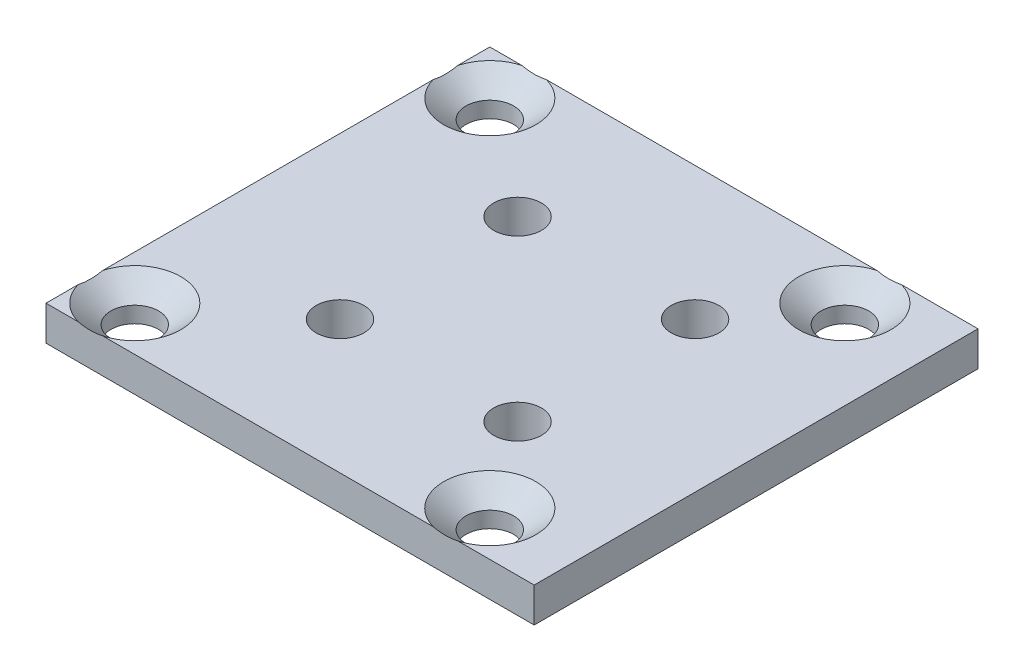
ISO-10303-21;
HEADER;
FILE_DESCRIPTION(('STEP AP214'),'2;1');
FILE_NAME('part.step','',(''),(''),'','','');
FILE_SCHEMA(('AUTOMOTIVE_DESIGN { 1 0 10303 214 1 1 1 1 }'));
ENDSEC;
DATA;
#1=APPLICATION_CONTEXT('core data for automotive mechanical design processes');
#2=APPLICATION_PROTOCOL_DEFINITION('international standard','automotive_design',2000,#1);
#3=PRODUCT_CONTEXT('',#1,'mechanical');
#4=PRODUCT('Part','Part','',(#3));
#5=PRODUCT_RELATED_PRODUCT_CATEGORY('part','',(#4));
#6=PRODUCT_DEFINITION_FORMATION('','',#4);
#7=PRODUCT_DEFINITION_CONTEXT('part definition',#1,'design');
#8=PRODUCT_DEFINITION('design','',#6,#7);
#9=PRODUCT_DEFINITION_SHAPE('','',#8);
#10=(LENGTH_UNIT() NAMED_UNIT(*) SI_UNIT(.MILLI.,.METRE.));
#11=(NAMED_UNIT(*) PLANE_ANGLE_UNIT() SI_UNIT($,.RADIAN.));
#12=(NAMED_UNIT(*) SI_UNIT($,.STERADIAN.) SOLID_ANGLE_UNIT());
#13=UNCERTAINTY_MEASURE_WITH_UNIT(LENGTH_MEASURE(1.E-05),#10,'distance_accuracy_value','');
#14=(GEOMETRIC_REPRESENTATION_CONTEXT(3) GLOBAL_UNCERTAINTY_ASSIGNED_CONTEXT((#13)) GLOBAL_UNIT_ASSIGNED_CONTEXT((#10,
#11,#12)) REPRESENTATION_CONTEXT('',''));
#15=CARTESIAN_POINT('',(0.,0.,0.));
#16=DIRECTION('',(0.,0.,1.));
#17=DIRECTION('',(1.,0.,0.));
#18=AXIS2_PLACEMENT_3D('',#15,#16,#17);
#19=CARTESIAN_POINT('',(0.,3.125,0.));
#20=DIRECTION('',(0.,-1.,0.));
#21=DIRECTION('',(0.,0.,-1.));
#22=AXIS2_PLACEMENT_3D('',#19,#20,#21);
#23=PLANE('',#22);
#24=CARTESIAN_POINT('',(-8.,3.125,-8.));
#25=DIRECTION('',(0.,1.,0.));
#26=DIRECTION('',(0.,0.,1.));
#27=AXIS2_PLACEMENT_3D('',#24,#25,#26);
#28=CIRCLE('',#27,2.14999999999999);
#29=CARTESIAN_POINT('',(-8.,3.125,-5.85000000000001));
#30=VERTEX_POINT('',#29);
#31=EDGE_CURVE('E152',#30,#30,#28,.T.);
#32=ORIENTED_EDGE('',*,*,#31,.F.);
#33=EDGE_LOOP('',(#32));
#34=FACE_BOUND('',#33,.T.);
#35=CARTESIAN_POINT('',(8.00000000000003,3.125,-7.99999999999997));
#36=DIRECTION('',(0.,1.,0.));
#37=DIRECTION('',(0.,0.,1.));
#38=AXIS2_PLACEMENT_3D('',#35,#36,#37);
#39=CIRCLE('',#38,2.14999999999999);
#40=CARTESIAN_POINT('',(8.00000000000003,3.125,-5.84999999999998));
#41=VERTEX_POINT('',#40);
#42=EDGE_CURVE('E159',#41,#41,#39,.T.);
#43=ORIENTED_EDGE('',*,*,#42,.F.);
#44=EDGE_LOOP('',(#43));
#45=FACE_BOUND('',#44,.T.);
#46=CARTESIAN_POINT('',(7.99999999999994,3.125,8.00000000000006));
#47=DIRECTION('',(0.,1.,0.));
#48=DIRECTION('',(0.,0.,1.));
#49=AXIS2_PLACEMENT_3D('',#46,#47,#48);
#50=CIRCLE('',#49,2.14999999999999);
#51=CARTESIAN_POINT('',(7.99999999999994,3.125,10.15));
#52=VERTEX_POINT('',#51);
#53=EDGE_CURVE('E165',#52,#52,#50,.T.);
#54=ORIENTED_EDGE('',*,*,#53,.F.);
#55=EDGE_LOOP('',(#54));
#56=FACE_BOUND('',#55,.T.);
#57=CARTESIAN_POINT('',(-8.00000000000008,3.125,7.99999999999992));
#58=DIRECTION('',(0.,1.,0.));
#59=DIRECTION('',(0.,0.,1.));
#60=AXIS2_PLACEMENT_3D('',#57,#58,#59);
#61=CIRCLE('',#60,2.14999999999999);
#62=CARTESIAN_POINT('',(-8.00000000000008,3.125,10.1499999999999));
#63=VERTEX_POINT('',#62);
#64=EDGE_CURVE('E171',#63,#63,#61,.T.);
#65=ORIENTED_EDGE('',*,*,#64,.F.);
#66=EDGE_LOOP('',(#65));
#67=FACE_BOUND('',#66,.T.);
#68=DIRECTION('',(0.,0.,-1.));
#69=VECTOR('',#68,1.);
#70=CARTESIAN_POINT('',(-22.5,3.125,-20.));
#71=LINE('',#70,#69);
#72=CARTESIAN_POINT('',(-22.5,3.125,14.8943327806252));
#73=VERTEX_POINT('',#72);
#74=CARTESIAN_POINT('',(-22.5,3.125,-14.8943327806252));
#75=VERTEX_POINT('',#74);
#76=EDGE_CURVE('E153',#73,#75,#71,.T.);
#77=ORIENTED_EDGE('',*,*,#76,.F.);
#78=CARTESIAN_POINT('',(-18.5,3.125,16.));
#79=DIRECTION('',(0.,-1.,0.));
#80=DIRECTION('',(0.,0.,-1.));
#81=AXIS2_PLACEMENT_3D('',#78,#79,#80);
#82=CIRCLE('',#81,4.15);
#83=CARTESIAN_POINT('',(-17.3943327806252,3.125,20.));
#84=VERTEX_POINT('',#83);
#85=EDGE_CURVE('E223',#73,#84,#82,.T.);
#86=ORIENTED_EDGE('',*,*,#85,.T.);
#87=DIRECTION('',(1.,0.,0.));
#88=VECTOR('',#87,1.);
#89=CARTESIAN_POINT('',(-21.5,3.125,20.));
#90=LINE('',#89,#88);
#91=CARTESIAN_POINT('',(12.3943327806252,3.125,20.));
#92=VERTEX_POINT('',#91);
#93=EDGE_CURVE('E202',#84,#92,#90,.T.);
#94=ORIENTED_EDGE('',*,*,#93,.T.);
#95=CARTESIAN_POINT('',(13.5,3.125,16.));
#96=DIRECTION('',(0.,-1.,0.));
#97=DIRECTION('',(0.,0.,-1.));
#98=AXIS2_PLACEMENT_3D('',#95,#96,#97);
#99=CIRCLE('',#98,4.15);
#100=CARTESIAN_POINT('',(14.6056672193748,3.125,20.));
#101=VERTEX_POINT('',#100);
#102=EDGE_CURVE('E214',#92,#101,#99,.T.);
#103=ORIENTED_EDGE('',*,*,#102,.T.);
#104=CARTESIAN_POINT('',(21.5,3.125,20.));
#105=VERTEX_POINT('',#104);
#106=EDGE_CURVE('E196',#101,#105,#90,.T.);
#107=ORIENTED_EDGE('',*,*,#106,.T.);
#108=DIRECTION('',(0.,0.,-1.));
#109=VECTOR('',#108,1.);
#110=CARTESIAN_POINT('',(21.5,3.125,20.));
#111=LINE('',#110,#109);
#112=CARTESIAN_POINT('',(21.5,3.125,-20.));
#113=VERTEX_POINT('',#112);
#114=EDGE_CURVE('E189',#105,#113,#111,.T.);
#115=ORIENTED_EDGE('',*,*,#114,.T.);
#116=DIRECTION('',(-1.,0.,0.));
#117=VECTOR('',#116,1.);
#118=CARTESIAN_POINT('',(-21.5,3.125,-20.));
#119=LINE('',#118,#117);
#120=CARTESIAN_POINT('',(14.6056672193749,3.125,-20.));
#121=VERTEX_POINT('',#120);
#122=EDGE_CURVE('E193',#113,#121,#119,.T.);
#123=ORIENTED_EDGE('',*,*,#122,.T.);
#124=CARTESIAN_POINT('',(13.5,3.125,-16.));
#125=DIRECTION('',(0.,-1.,0.));
#126=DIRECTION('',(0.,0.,-1.));
#127=AXIS2_PLACEMENT_3D('',#124,#125,#126);
#128=CIRCLE('',#127,4.15000000000001);
#129=CARTESIAN_POINT('',(12.3943327806252,3.125,-20.));
#130=VERTEX_POINT('',#129);
#131=EDGE_CURVE('E211',#121,#130,#128,.T.);
#132=ORIENTED_EDGE('',*,*,#131,.T.);
#133=CARTESIAN_POINT('',(-17.3943327806251,3.125,-20.));
#134=VERTEX_POINT('',#133);
#135=EDGE_CURVE('E197',#130,#134,#119,.T.);
#136=ORIENTED_EDGE('',*,*,#135,.T.);
#137=CARTESIAN_POINT('',(-18.5,3.125,-16.));
#138=DIRECTION('',(0.,-1.,0.));
#139=DIRECTION('',(0.,0.,-1.));
#140=AXIS2_PLACEMENT_3D('',#137,#138,#139);
#141=CIRCLE('',#140,4.15000000000001);
#142=EDGE_CURVE('E218',#134,#75,#141,.T.);
#143=ORIENTED_EDGE('',*,*,#142,.T.);
#144=EDGE_LOOP('',(#77,#86,#94,#103,#107,#115,#123,#132,#136,#143));
#145=FACE_BOUND('',#144,.T.);
#146=ADVANCED_FACE('F41',(#34,#45,#56,#67,#145),#23,.F.);
#147=CARTESIAN_POINT('',(-22.5,3.125,20.));
#148=VERTEX_POINT('',#147);
#149=CARTESIAN_POINT('',(-19.6056672193748,3.125,20.));
#150=VERTEX_POINT('',#149);
#151=EDGE_CURVE('E198',#148,#150,#90,.T.);
#152=ORIENTED_EDGE('',*,*,#151,.T.);
#153=CARTESIAN_POINT('',(-18.5,3.125,16.));
#154=DIRECTION('',(0.,-1.,0.));
#155=DIRECTION('',(0.,0.,-1.));
#156=AXIS2_PLACEMENT_3D('',#153,#154,#155);
#157=CIRCLE('',#156,4.15);
#158=CARTESIAN_POINT('',(-22.5,3.125,17.1056672193748));
#159=VERTEX_POINT('',#158);
#160=EDGE_CURVE('E221',#150,#159,#157,.T.);
#161=ORIENTED_EDGE('',*,*,#160,.T.);
#162=EDGE_CURVE('E150',#148,#159,#71,.T.);
#163=ORIENTED_EDGE('',*,*,#162,.F.);
#164=EDGE_LOOP('',(#152,#161,#163));
#165=FACE_BOUND('',#164,.T.);
#166=ADVANCED_FACE('F329',(#165),#23,.F.);
#167=CARTESIAN_POINT('',(21.5,3.125,20.));
#168=DIRECTION('',(-1.,0.,0.));
#169=DIRECTION('',(0.,0.,1.));
#170=AXIS2_PLACEMENT_3D('',#167,#168,#169);
#171=PLANE('',#170);
#172=DIRECTION('',(0.,0.,-1.));
#173=VECTOR('',#172,1.);
#174=CARTESIAN_POINT('',(21.5,0.,20.));
#175=LINE('',#174,#173);
#176=CARTESIAN_POINT('',(21.5,0.,20.));
#177=VERTEX_POINT('',#176);
#178=CARTESIAN_POINT('',(21.5,0.,-20.));
#179=VERTEX_POINT('',#178);
#180=EDGE_CURVE('E132',#177,#179,#175,.T.);
#181=ORIENTED_EDGE('',*,*,#180,.T.);
#182=DIRECTION('',(0.,-1.,0.));
#183=VECTOR('',#182,1.);
#184=CARTESIAN_POINT('',(21.5,3.125,-20.));
#185=LINE('',#184,#183);
#186=EDGE_CURVE('E127',#113,#179,#185,.T.);
#187=ORIENTED_EDGE('',*,*,#186,.F.);
#188=ORIENTED_EDGE('',*,*,#114,.F.);
#189=DIRECTION('',(0.,-1.,0.));
#190=VECTOR('',#189,1.);
#191=CARTESIAN_POINT('',(21.5,3.125,20.));
#192=LINE('',#191,#190);
#193=EDGE_CURVE('E201',#105,#177,#192,.T.);
#194=ORIENTED_EDGE('',*,*,#193,.T.);
#195=EDGE_LOOP('',(#181,#187,#188,#194));
#196=FACE_BOUND('',#195,.T.);
#197=ADVANCED_FACE('F254',(#196),#171,.F.);
#198=CARTESIAN_POINT('',(-21.5,3.125,-20.));
#199=DIRECTION('',(0.,0.,1.));
#200=DIRECTION('',(1.,0.,0.));
#201=AXIS2_PLACEMENT_3D('',#198,#199,#200);
#202=PLANE('',#201);
#203=CARTESIAN_POINT('',(-19.6056672193748,3.125,-20.));
#204=VERTEX_POINT('',#203);
#205=CARTESIAN_POINT('',(-22.5,3.125,-20.));
#206=VERTEX_POINT('',#205);
#207=EDGE_CURVE('E192',#204,#206,#119,.T.);
#208=ORIENTED_EDGE('',*,*,#207,.F.);
#209=CARTESIAN_POINT('',(-19.6056672193748,3.125,-20.));
#210=CARTESIAN_POINT('',(-19.5357221427361,3.10936150913505,-20.));
#211=CARTESIAN_POINT('',(-19.465486015488,3.09504081489913,-20.));
#212=CARTESIAN_POINT('',(-19.3244853267123,3.06920691655071,-20.));
#213=CARTESIAN_POINT('',(-19.2537206584983,3.05769429594836,-20.));
#214=CARTESIAN_POINT('',(-19.0407188629885,3.02762992715909,-20.));
#215=CARTESIAN_POINT('',(-18.8978127424541,3.01356052370965,-20.));
#216=CARTESIAN_POINT('',(-18.6140103942661,2.99843351019635,-20.));
#217=CARTESIAN_POINT('',(-18.4731266595971,2.99713710642101,-20.));
#218=CARTESIAN_POINT('',(-18.1918741309777,3.00701589463506,-20.));
#219=CARTESIAN_POINT('',(-18.0515050490301,3.01818249106688,-20.));
#220=CARTESIAN_POINT('',(-17.8685622718198,3.04050588756117,-20.));
#221=CARTESIAN_POINT('',(-17.8252884022186,3.04636123486814,-20.));
#222=CARTESIAN_POINT('',(-17.7389077202227,3.05916645281211,-20.));
#223=CARTESIAN_POINT('',(-17.6958008840591,3.06611616138666,-20.));
#224=CARTESIAN_POINT('',(-17.5662397079567,3.08864059426218,-20.));
#225=CARTESIAN_POINT('',(-17.4800613240869,3.10582682513863,-20.));
#226=CARTESIAN_POINT('',(-17.3943327806251,3.125,-20.));
#227=B_SPLINE_CURVE_WITH_KNOTS('',3,(#209,#210,#211,#212,#213,#214,#215,#216,#217,#218,#219,
#220,#221,#222,#223,#224,#225,#226),.UNSPECIFIED.,.F.,.F.,(4,2,2,2,2,2,2,2,4),(0.,
0.214992742343919,0.430030121614323,0.860223901715208,1.28235951314072,1.70420416332892,
1.83520082687546,1.96617810952037,2.22969253364859),.UNSPECIFIED.);
#228=EDGE_CURVE('E264',#204,#134,#227,.T.);
#229=ORIENTED_EDGE('',*,*,#228,.T.);
#230=ORIENTED_EDGE('',*,*,#135,.F.);
#231=CARTESIAN_POINT('',(12.3943327806252,3.125,-20.));
#232=CARTESIAN_POINT('',(12.4642778572639,3.10936150913505,-20.));
#233=CARTESIAN_POINT('',(12.534513984512,3.09504081489913,-20.));
#234=CARTESIAN_POINT('',(12.6755146732877,3.06920691655071,-20.));
#235=CARTESIAN_POINT('',(12.7462793415017,3.05769429594836,-20.));
#236=CARTESIAN_POINT('',(12.9592811370115,3.02762992715909,-20.));
#237=CARTESIAN_POINT('',(13.1021872575459,3.01356052370965,-20.));
#238=CARTESIAN_POINT('',(13.3859896057339,2.99843351019635,-20.));
#239=CARTESIAN_POINT('',(13.5268733404029,2.99713710642101,-20.));
#240=CARTESIAN_POINT('',(13.8081258690223,3.00701589463506,-20.));
#241=CARTESIAN_POINT('',(13.9484949509699,3.01818249106688,-20.));
#242=CARTESIAN_POINT('',(14.1314377281802,3.04050588756117,-20.));
#243=CARTESIAN_POINT('',(14.1747115977814,3.04636123486814,-20.));
#244=CARTESIAN_POINT('',(14.2610922797773,3.05916645281211,-20.));
#245=CARTESIAN_POINT('',(14.3041991159409,3.06611616138666,-20.));
#246=CARTESIAN_POINT('',(14.4337602920433,3.08864059426218,-20.));
#247=CARTESIAN_POINT('',(14.5199386759131,3.10582682513863,-20.));
#248=CARTESIAN_POINT('',(14.6056672193749,3.125,-20.));
#249=B_SPLINE_CURVE_WITH_KNOTS('',3,(#231,#232,#233,#234,#235,#236,#237,#238,#239,#240,#241,
#242,#243,#244,#245,#246,#247,#248),.UNSPECIFIED.,.F.,.F.,(4,2,2,2,2,2,2,2,4),(0.,
0.214992742343919,0.430030121614327,0.86022390171521,1.28235951314072,1.70420416332892,
1.83520082687547,1.96617810952037,2.22969253364859),.UNSPECIFIED.);
#250=EDGE_CURVE('E257',#130,#121,#249,.T.);
#251=ORIENTED_EDGE('',*,*,#250,.T.);
#252=ORIENTED_EDGE('',*,*,#122,.F.);
#253=ORIENTED_EDGE('',*,*,#186,.T.);
#254=DIRECTION('',(-1.,0.,0.));
#255=VECTOR('',#254,1.);
#256=CARTESIAN_POINT('',(-21.5,0.,-20.));
#257=LINE('',#256,#255);
#258=CARTESIAN_POINT('',(-22.5,0.,-20.));
#259=VERTEX_POINT('',#258);
#260=EDGE_CURVE('E120',#179,#259,#257,.T.);
#261=ORIENTED_EDGE('',*,*,#260,.T.);
#262=DIRECTION('',(0.,-1.,0.));
#263=VECTOR('',#262,1.);
#264=CARTESIAN_POINT('',(-22.5,0.,-20.));
#265=LINE('',#264,#263);
#266=EDGE_CURVE('E125',#206,#259,#265,.T.);
#267=ORIENTED_EDGE('',*,*,#266,.F.);
#268=EDGE_LOOP('',(#208,#229,#230,#251,#252,#253,#261,#267));
#269=FACE_BOUND('',#268,.T.);
#270=ADVANCED_FACE('F123',(#269),#202,.F.);
#271=CARTESIAN_POINT('',(-21.5,3.125,20.));
#272=DIRECTION('',(0.,0.,-1.));
#273=DIRECTION('',(-1.,0.,0.));
#274=AXIS2_PLACEMENT_3D('',#271,#272,#273);
#275=PLANE('',#274);
#276=ORIENTED_EDGE('',*,*,#93,.F.);
#277=CARTESIAN_POINT('',(-17.3943327806252,3.125,20.));
#278=CARTESIAN_POINT('',(-17.464277857264,3.10936150913505,20.));
#279=CARTESIAN_POINT('',(-17.534513984512,3.09504081489913,20.));
#280=CARTESIAN_POINT('',(-17.6755146732878,3.06920691655071,20.));
#281=CARTESIAN_POINT('',(-17.7462793415017,3.05769429594836,20.));
#282=CARTESIAN_POINT('',(-17.9592811370116,3.0276299271591,20.));
#283=CARTESIAN_POINT('',(-18.1021872575459,3.01356052370966,20.));
#284=CARTESIAN_POINT('',(-18.385989605734,2.99843351019636,20.));
#285=CARTESIAN_POINT('',(-18.526873340403,2.99713710642103,20.));
#286=CARTESIAN_POINT('',(-18.8081258690224,3.00701589463507,20.));
#287=CARTESIAN_POINT('',(-18.9484949509699,3.0181824910669,20.));
#288=CARTESIAN_POINT('',(-19.1314377281803,3.04050588756118,20.));
#289=CARTESIAN_POINT('',(-19.1747115977814,3.04636123486816,20.));
#290=CARTESIAN_POINT('',(-19.2610922797773,3.05916645281212,20.));
#291=CARTESIAN_POINT('',(-19.3041991159409,3.06611616138667,20.));
#292=CARTESIAN_POINT('',(-19.4337602920433,3.08864059426219,20.));
#293=CARTESIAN_POINT('',(-19.5199386759131,3.10582682513863,20.));
#294=CARTESIAN_POINT('',(-19.6056672193748,3.125,20.));
#295=B_SPLINE_CURVE_WITH_KNOTS('',3,(#277,#278,#279,#280,#281,#282,#283,#284,#285,#286,#287,
#288,#289,#290,#291,#292,#293,#294),.UNSPECIFIED.,.F.,.F.,(4,2,2,2,2,2,2,2,4),(0.,
0.214992742343922,0.430030121614333,0.860223901715214,1.28235951314073,1.70420416332894,
1.83520082687546,1.96617810952034,2.22969253364851),.UNSPECIFIED.);
#296=EDGE_CURVE('E232',#84,#150,#295,.T.);
#297=ORIENTED_EDGE('',*,*,#296,.T.);
#298=ORIENTED_EDGE('',*,*,#151,.F.);
#299=DIRECTION('',(0.,1.,0.));
#300=VECTOR('',#299,1.);
#301=CARTESIAN_POINT('',(-22.5,0.,20.));
#302=LINE('',#301,#300);
#303=CARTESIAN_POINT('',(-22.5,0.,20.));
#304=VERTEX_POINT('',#303);
#305=EDGE_CURVE('E140',#304,#148,#302,.T.);
#306=ORIENTED_EDGE('',*,*,#305,.F.);
#307=DIRECTION('',(1.,0.,0.));
#308=VECTOR('',#307,1.);
#309=CARTESIAN_POINT('',(-21.5,0.,20.));
#310=LINE('',#309,#308);
#311=EDGE_CURVE('E131',#304,#177,#310,.T.);
#312=ORIENTED_EDGE('',*,*,#311,.T.);
#313=ORIENTED_EDGE('',*,*,#193,.F.);
#314=ORIENTED_EDGE('',*,*,#106,.F.);
#315=CARTESIAN_POINT('',(14.6056672193748,3.125,20.));
#316=CARTESIAN_POINT('',(14.535722142736,3.10936150913505,20.));
#317=CARTESIAN_POINT('',(14.465486015488,3.09504081489913,20.));
#318=CARTESIAN_POINT('',(14.3244853267122,3.06920691655071,20.));
#319=CARTESIAN_POINT('',(14.2537206584983,3.05769429594836,20.));
#320=CARTESIAN_POINT('',(14.0407188629884,3.0276299271591,20.));
#321=CARTESIAN_POINT('',(13.8978127424541,3.01356052370966,20.));
#322=CARTESIAN_POINT('',(13.614010394266,2.99843351019636,20.));
#323=CARTESIAN_POINT('',(13.473126659597,2.99713710642103,20.));
#324=CARTESIAN_POINT('',(13.1918741309776,3.00701589463507,20.));
#325=CARTESIAN_POINT('',(13.0515050490301,3.0181824910669,20.));
#326=CARTESIAN_POINT('',(12.8685622718197,3.04050588756118,20.));
#327=CARTESIAN_POINT('',(12.8252884022186,3.04636123486816,20.));
#328=CARTESIAN_POINT('',(12.7389077202227,3.05916645281212,20.));
#329=CARTESIAN_POINT('',(12.6958008840591,3.06611616138667,20.));
#330=CARTESIAN_POINT('',(12.5662397079567,3.08864059426219,20.));
#331=CARTESIAN_POINT('',(12.4800613240869,3.10582682513863,20.));
#332=CARTESIAN_POINT('',(12.3943327806252,3.125,20.));
#333=B_SPLINE_CURVE_WITH_KNOTS('',3,(#315,#316,#317,#318,#319,#320,#321,#322,#323,#324,#325,
#326,#327,#328,#329,#330,#331,#332),.UNSPECIFIED.,.F.,.F.,(4,2,2,2,2,2,2,2,4),(0.,
0.214992742343921,0.430030121614333,0.860223901715221,1.28235951314073,1.70420416332894,
1.83520082687547,1.96617810952034,2.22969253364851),.UNSPECIFIED.);
#334=EDGE_CURVE('E57',#101,#92,#333,.T.);
#335=ORIENTED_EDGE('',*,*,#334,.T.);
#336=EDGE_LOOP('',(#276,#297,#298,#306,#312,#313,#314,#335));
#337=FACE_BOUND('',#336,.T.);
#338=ADVANCED_FACE('F243',(#337),#275,.F.);
#339=CARTESIAN_POINT('',(-22.5,3.125,-17.1056672193748));
#340=VERTEX_POINT('',#339);
#341=EDGE_CURVE('E145',#340,#206,#71,.T.);
#342=ORIENTED_EDGE('',*,*,#341,.F.);
#343=CARTESIAN_POINT('',(-18.5,3.125,-16.));
#344=DIRECTION('',(0.,-1.,0.));
#345=DIRECTION('',(0.,0.,-1.));
#346=AXIS2_PLACEMENT_3D('',#343,#344,#345);
#347=CIRCLE('',#346,4.15000000000001);
#348=EDGE_CURVE('E216',#340,#204,#347,.T.);
#349=ORIENTED_EDGE('',*,*,#348,.T.);
#350=ORIENTED_EDGE('',*,*,#207,.T.);
#351=EDGE_LOOP('',(#342,#349,#350));
#352=FACE_BOUND('',#351,.T.);
#353=ADVANCED_FACE('F248',(#352),#23,.F.);
#354=CARTESIAN_POINT('',(0.,0.,0.));
#355=DIRECTION('',(0.,-1.,0.));
#356=DIRECTION('',(0.,0.,-1.));
#357=AXIS2_PLACEMENT_3D('',#354,#355,#356);
#358=PLANE('',#357);
#359=CARTESIAN_POINT('',(-8.,0.,-8.));
#360=DIRECTION('',(0.,1.,0.));
#361=DIRECTION('',(0.,0.,1.));
#362=AXIS2_PLACEMENT_3D('',#359,#360,#361);
#363=CIRCLE('',#362,2.15);
#364=CARTESIAN_POINT('',(-8.,0.,-5.85));
#365=VERTEX_POINT('',#364);
#366=EDGE_CURVE('E156',#365,#365,#363,.T.);
#367=ORIENTED_EDGE('',*,*,#366,.T.);
#368=EDGE_LOOP('',(#367));
#369=FACE_BOUND('',#368,.T.);
#370=CARTESIAN_POINT('',(8.00000000000003,0.,-7.99999999999997));
#371=DIRECTION('',(0.,1.,0.));
#372=DIRECTION('',(0.,0.,1.));
#373=AXIS2_PLACEMENT_3D('',#370,#371,#372);
#374=CIRCLE('',#373,2.15);
#375=CARTESIAN_POINT('',(8.00000000000003,0.,-5.84999999999997));
#376=VERTEX_POINT('',#375);
#377=EDGE_CURVE('E162',#376,#376,#374,.T.);
#378=ORIENTED_EDGE('',*,*,#377,.T.);
#379=EDGE_LOOP('',(#378));
#380=FACE_BOUND('',#379,.T.);
#381=CARTESIAN_POINT('',(7.99999999999994,0.,8.00000000000006));
#382=DIRECTION('',(0.,1.,0.));
#383=DIRECTION('',(0.,0.,1.));
#384=AXIS2_PLACEMENT_3D('',#381,#382,#383);
#385=CIRCLE('',#384,2.15);
#386=CARTESIAN_POINT('',(7.99999999999994,0.,10.1500000000001));
#387=VERTEX_POINT('',#386);
#388=EDGE_CURVE('E168',#387,#387,#385,.T.);
#389=ORIENTED_EDGE('',*,*,#388,.T.);
#390=EDGE_LOOP('',(#389));
#391=FACE_BOUND('',#390,.T.);
#392=CARTESIAN_POINT('',(-8.00000000000008,0.,7.99999999999992));
#393=DIRECTION('',(0.,1.,0.));
#394=DIRECTION('',(0.,0.,1.));
#395=AXIS2_PLACEMENT_3D('',#392,#393,#394);
#396=CIRCLE('',#395,2.15);
#397=CARTESIAN_POINT('',(-8.00000000000008,0.,10.1499999999999));
#398=VERTEX_POINT('',#397);
#399=EDGE_CURVE('E174',#398,#398,#396,.T.);
#400=ORIENTED_EDGE('',*,*,#399,.T.);
#401=EDGE_LOOP('',(#400));
#402=FACE_BOUND('',#401,.T.);
#403=CARTESIAN_POINT('',(-18.5,0.,-16.));
#404=DIRECTION('',(0.,1.,0.));
#405=DIRECTION('',(0.,0.,1.));
#406=AXIS2_PLACEMENT_3D('',#403,#404,#405);
#407=CIRCLE('',#406,2.15);
#408=CARTESIAN_POINT('',(-18.5,0.,-13.85));
#409=VERTEX_POINT('',#408);
#410=EDGE_CURVE('E177',#409,#409,#407,.T.);
#411=ORIENTED_EDGE('',*,*,#410,.T.);
#412=EDGE_LOOP('',(#411));
#413=FACE_BOUND('',#412,.T.);
#414=CARTESIAN_POINT('',(13.5,0.,-16.));
#415=DIRECTION('',(0.,1.,0.));
#416=DIRECTION('',(0.,0.,1.));
#417=AXIS2_PLACEMENT_3D('',#414,#415,#416);
#418=CIRCLE('',#417,2.15);
#419=CARTESIAN_POINT('',(13.5,0.,-13.85));
#420=VERTEX_POINT('',#419);
#421=EDGE_CURVE('E180',#420,#420,#418,.T.);
#422=ORIENTED_EDGE('',*,*,#421,.T.);
#423=EDGE_LOOP('',(#422));
#424=FACE_BOUND('',#423,.T.);
#425=CARTESIAN_POINT('',(13.5,0.,16.));
#426=DIRECTION('',(0.,1.,0.));
#427=DIRECTION('',(0.,0.,1.));
#428=AXIS2_PLACEMENT_3D('',#425,#426,#427);
#429=CIRCLE('',#428,2.15);
#430=CARTESIAN_POINT('',(13.5,0.,18.15));
#431=VERTEX_POINT('',#430);
#432=EDGE_CURVE('E183',#431,#431,#429,.T.);
#433=ORIENTED_EDGE('',*,*,#432,.T.);
#434=EDGE_LOOP('',(#433));
#435=FACE_BOUND('',#434,.T.);
#436=CARTESIAN_POINT('',(-18.5,0.,16.));
#437=DIRECTION('',(0.,1.,0.));
#438=DIRECTION('',(0.,0.,1.));
#439=AXIS2_PLACEMENT_3D('',#436,#437,#438);
#440=CIRCLE('',#439,2.15);
#441=CARTESIAN_POINT('',(-18.5,0.,18.15));
#442=VERTEX_POINT('',#441);
#443=EDGE_CURVE('E186',#442,#442,#440,.T.);
#444=ORIENTED_EDGE('',*,*,#443,.T.);
#445=EDGE_LOOP('',(#444));
#446=FACE_BOUND('',#445,.T.);
#447=ORIENTED_EDGE('',*,*,#180,.F.);
#448=ORIENTED_EDGE('',*,*,#311,.F.);
#449=DIRECTION('',(0.,0.,1.));
#450=VECTOR('',#449,1.);
#451=CARTESIAN_POINT('',(-22.5,0.,-20.));
#452=LINE('',#451,#450);
#453=EDGE_CURVE('E135',#259,#304,#452,.T.);
#454=ORIENTED_EDGE('',*,*,#453,.F.);
#455=ORIENTED_EDGE('',*,*,#260,.F.);
#456=EDGE_LOOP('',(#447,#448,#454,#455));
#457=FACE_BOUND('',#456,.T.);
#458=ADVANCED_FACE('F136',(#369,#380,#391,#402,#413,#424,#435,#446,#457),#358,.T.);
#459=CARTESIAN_POINT('',(-18.5,3.125,16.));
#460=DIRECTION('',(0.,1.,0.));
#461=DIRECTION('',(0.,0.,1.));
#462=AXIS2_PLACEMENT_3D('',#459,#460,#461);
#463=CYLINDRICAL_SURFACE('',#462,2.15);
#464=CARTESIAN_POINT('',(-18.5,1.44680073764545,16.));
#465=DIRECTION('',(0.,-1.,0.));
#466=DIRECTION('',(0.,0.,-1.));
#467=AXIS2_PLACEMENT_3D('',#464,#465,#466);
#468=CIRCLE('',#467,2.15);
#469=CARTESIAN_POINT('',(-18.5,1.44680073764545,13.85));
#470=VERTEX_POINT('',#469);
#471=EDGE_CURVE('E208',#470,#470,#468,.F.);
#472=ORIENTED_EDGE('',*,*,#471,.T.);
#473=EDGE_LOOP('',(#472));
#474=FACE_BOUND('',#473,.T.);
#475=ORIENTED_EDGE('',*,*,#443,.F.);
#476=EDGE_LOOP('',(#475));
#477=FACE_BOUND('',#476,.T.);
#478=ADVANCED_FACE('F323',(#474,#477),#463,.F.);
#479=CARTESIAN_POINT('',(13.5,3.125,16.));
#480=DIRECTION('',(0.,1.,0.));
#481=DIRECTION('',(0.,0.,1.));
#482=AXIS2_PLACEMENT_3D('',#479,#480,#481);
#483=CYLINDRICAL_SURFACE('',#482,2.15);
#484=CARTESIAN_POINT('',(13.5,1.44680073764545,16.));
#485=DIRECTION('',(0.,-1.,0.));
#486=DIRECTION('',(0.,0.,-1.));
#487=AXIS2_PLACEMENT_3D('',#484,#485,#486);
#488=CIRCLE('',#487,2.15);
#489=CARTESIAN_POINT('',(13.5,1.44680073764545,13.85));
#490=VERTEX_POINT('',#489);
#491=EDGE_CURVE('E51',#490,#490,#488,.F.);
#492=ORIENTED_EDGE('',*,*,#491,.T.);
#493=EDGE_LOOP('',(#492));
#494=FACE_BOUND('',#493,.T.);
#495=ORIENTED_EDGE('',*,*,#432,.F.);
#496=EDGE_LOOP('',(#495));
#497=FACE_BOUND('',#496,.T.);
#498=ADVANCED_FACE('F319',(#494,#497),#483,.F.);
#499=CARTESIAN_POINT('',(13.5,3.125,-16.));
#500=DIRECTION('',(0.,1.,0.));
#501=DIRECTION('',(0.,0.,1.));
#502=AXIS2_PLACEMENT_3D('',#499,#500,#501);
#503=CYLINDRICAL_SURFACE('',#502,2.15);
#504=CARTESIAN_POINT('',(13.5,1.44680073764541,-16.));
#505=DIRECTION('',(0.,-1.,0.));
#506=DIRECTION('',(0.,0.,-1.));
#507=AXIS2_PLACEMENT_3D('',#504,#505,#506);
#508=CIRCLE('',#507,2.15);
#509=CARTESIAN_POINT('',(13.5,1.44680073764541,-18.15));
#510=VERTEX_POINT('',#509);
#511=EDGE_CURVE('E11',#510,#510,#508,.F.);
#512=ORIENTED_EDGE('',*,*,#511,.T.);
#513=EDGE_LOOP('',(#512));
#514=FACE_BOUND('',#513,.T.);
#515=ORIENTED_EDGE('',*,*,#421,.F.);
#516=EDGE_LOOP('',(#515));
#517=FACE_BOUND('',#516,.T.);
#518=ADVANCED_FACE('F315',(#514,#517),#503,.F.);
#519=CARTESIAN_POINT('',(-18.5,3.125,-16.));
#520=DIRECTION('',(0.,1.,0.));
#521=DIRECTION('',(0.,0.,1.));
#522=AXIS2_PLACEMENT_3D('',#519,#520,#521);
#523=CYLINDRICAL_SURFACE('',#522,2.15);
#524=CARTESIAN_POINT('',(-18.5,1.44680073764541,-16.));
#525=DIRECTION('',(0.,-1.,0.));
#526=DIRECTION('',(0.,0.,-1.));
#527=AXIS2_PLACEMENT_3D('',#524,#525,#526);
#528=CIRCLE('',#527,2.15);
#529=CARTESIAN_POINT('',(-18.5,1.44680073764541,-18.15));
#530=VERTEX_POINT('',#529);
#531=EDGE_CURVE('E350',#530,#530,#528,.F.);
#532=ORIENTED_EDGE('',*,*,#531,.T.);
#533=EDGE_LOOP('',(#532));
#534=FACE_BOUND('',#533,.T.);
#535=ORIENTED_EDGE('',*,*,#410,.F.);
#536=EDGE_LOOP('',(#535));
#537=FACE_BOUND('',#536,.T.);
#538=ADVANCED_FACE('F311',(#534,#537),#523,.F.);
#539=CARTESIAN_POINT('',(-8.00000000000008,3.125,7.99999999999992));
#540=DIRECTION('',(0.,1.,0.));
#541=DIRECTION('',(0.,0.,1.));
#542=AXIS2_PLACEMENT_3D('',#539,#540,#541);
#543=CYLINDRICAL_SURFACE('',#542,2.14999999999999);
#544=ORIENTED_EDGE('',*,*,#399,.F.);
#545=EDGE_LOOP('',(#544));
#546=FACE_BOUND('',#545,.T.);
#547=ORIENTED_EDGE('',*,*,#64,.T.);
#548=EDGE_LOOP('',(#547));
#549=FACE_BOUND('',#548,.T.);
#550=ADVANCED_FACE('F307',(#546,#549),#543,.F.);
#551=CARTESIAN_POINT('',(7.99999999999994,3.125,8.00000000000006));
#552=DIRECTION('',(0.,1.,0.));
#553=DIRECTION('',(0.,0.,1.));
#554=AXIS2_PLACEMENT_3D('',#551,#552,#553);
#555=CYLINDRICAL_SURFACE('',#554,2.14999999999999);
#556=ORIENTED_EDGE('',*,*,#388,.F.);
#557=EDGE_LOOP('',(#556));
#558=FACE_BOUND('',#557,.T.);
#559=ORIENTED_EDGE('',*,*,#53,.T.);
#560=EDGE_LOOP('',(#559));
#561=FACE_BOUND('',#560,.T.);
#562=ADVANCED_FACE('F303',(#558,#561),#555,.F.);
#563=CARTESIAN_POINT('',(8.00000000000003,3.125,-7.99999999999997));
#564=DIRECTION('',(0.,1.,0.));
#565=DIRECTION('',(0.,0.,1.));
#566=AXIS2_PLACEMENT_3D('',#563,#564,#565);
#567=CYLINDRICAL_SURFACE('',#566,2.14999999999999);
#568=ORIENTED_EDGE('',*,*,#377,.F.);
#569=EDGE_LOOP('',(#568));
#570=FACE_BOUND('',#569,.T.);
#571=ORIENTED_EDGE('',*,*,#42,.T.);
#572=EDGE_LOOP('',(#571));
#573=FACE_BOUND('',#572,.T.);
#574=ADVANCED_FACE('F299',(#570,#573),#567,.F.);
#575=CARTESIAN_POINT('',(-8.,3.125,-8.));
#576=DIRECTION('',(0.,1.,0.));
#577=DIRECTION('',(0.,0.,1.));
#578=AXIS2_PLACEMENT_3D('',#575,#576,#577);
#579=CYLINDRICAL_SURFACE('',#578,2.14999999999999);
#580=ORIENTED_EDGE('',*,*,#366,.F.);
#581=EDGE_LOOP('',(#580));
#582=FACE_BOUND('',#581,.T.);
#583=ORIENTED_EDGE('',*,*,#31,.T.);
#584=EDGE_LOOP('',(#583));
#585=FACE_BOUND('',#584,.T.);
#586=ADVANCED_FACE('F295',(#582,#585),#579,.F.);
#587=CARTESIAN_POINT('',(-22.5,0.,0.));
#588=DIRECTION('',(1.,0.,0.));
#589=DIRECTION('',(0.,0.,-1.));
#590=AXIS2_PLACEMENT_3D('',#587,#588,#589);
#591=PLANE('',#590);
#592=ORIENTED_EDGE('',*,*,#162,.T.);
#593=CARTESIAN_POINT('',(-22.5,3.125,17.1056672193748));
#594=CARTESIAN_POINT('',(-22.5,3.10936150913505,17.035722142736));
#595=CARTESIAN_POINT('',(-22.5,3.09504081489913,16.9654860154879));
#596=CARTESIAN_POINT('',(-22.5,3.06920691655071,16.8244853267122));
#597=CARTESIAN_POINT('',(-22.5,3.05769429594837,16.7537206584983));
#598=CARTESIAN_POINT('',(-22.5,3.0276299271591,16.5407188629884));
#599=CARTESIAN_POINT('',(-22.5,3.01356052370966,16.3978127424541));
#600=CARTESIAN_POINT('',(-22.5,2.99843351019636,16.114010394266));
#601=CARTESIAN_POINT('',(-22.5,2.99713710642103,15.973126659597));
#602=CARTESIAN_POINT('',(-22.5,3.00701589463508,15.6918741309776));
#603=CARTESIAN_POINT('',(-22.5,3.01818249106691,15.5515050490301));
#604=CARTESIAN_POINT('',(-22.5,3.04050588756119,15.3685622718197));
#605=CARTESIAN_POINT('',(-22.5,3.04636123486817,15.3252884022186));
#606=CARTESIAN_POINT('',(-22.5,3.05916645281213,15.2389077202227));
#607=CARTESIAN_POINT('',(-22.5,3.06611616138668,15.1958008840591));
#608=CARTESIAN_POINT('',(-22.5,3.08864059426219,15.0662397079567));
#609=CARTESIAN_POINT('',(-22.5,3.10582682513864,14.9800613240869));
#610=CARTESIAN_POINT('',(-22.5,3.125,14.8943327806252));
#611=B_SPLINE_CURVE_WITH_KNOTS('',3,(#593,#594,#595,#596,#597,#598,#599,#600,#601,#602,#603,
#604,#605,#606,#607,#608,#609,#610),.UNSPECIFIED.,.F.,.F.,(4,2,2,2,2,2,2,2,4),(0.,
0.214992742343919,0.430030121614325,0.860223901715217,1.28235951314073,1.70420416332894,
1.83520082687545,1.96617810952031,2.22969253364846),.UNSPECIFIED.);
#612=EDGE_CURVE('E287',#159,#73,#611,.T.);
#613=ORIENTED_EDGE('',*,*,#612,.T.);
#614=ORIENTED_EDGE('',*,*,#76,.T.);
#615=CARTESIAN_POINT('',(-22.5,3.125,-14.8943327806252));
#616=CARTESIAN_POINT('',(-22.5,3.10936150913505,-14.9642778572639));
#617=CARTESIAN_POINT('',(-22.5,3.09504081489913,-15.034513984512));
#618=CARTESIAN_POINT('',(-22.5,3.06920691655071,-15.1755146732878));
#619=CARTESIAN_POINT('',(-22.5,3.05769429594836,-15.2462793415017));
#620=CARTESIAN_POINT('',(-22.5,3.0276299271591,-15.4592811370115));
#621=CARTESIAN_POINT('',(-22.5,3.01356052370965,-15.6021872575459));
#622=CARTESIAN_POINT('',(-22.5,2.99843351019635,-15.8859896057339));
#623=CARTESIAN_POINT('',(-22.5,2.99713710642102,-16.0268733404029));
#624=CARTESIAN_POINT('',(-22.5,3.00701589463506,-16.3081258690224));
#625=CARTESIAN_POINT('',(-22.5,3.01818249106689,-16.4484949509699));
#626=CARTESIAN_POINT('',(-22.5,3.04050588756117,-16.6314377281802));
#627=CARTESIAN_POINT('',(-22.5,3.04636123486815,-16.6747115977814));
#628=CARTESIAN_POINT('',(-22.5,3.05916645281211,-16.7610922797773));
#629=CARTESIAN_POINT('',(-22.5,3.06611616138666,-16.8041991159409));
#630=CARTESIAN_POINT('',(-22.5,3.08864059426218,-16.9337602920433));
#631=CARTESIAN_POINT('',(-22.5,3.10582682513863,-17.0199386759131));
#632=CARTESIAN_POINT('',(-22.5,3.125,-17.1056672193748));
#633=B_SPLINE_CURVE_WITH_KNOTS('',3,(#615,#616,#617,#618,#619,#620,#621,#622,#623,#624,#625,
#626,#627,#628,#629,#630,#631,#632),.UNSPECIFIED.,.F.,.F.,(4,2,2,2,2,2,2,2,4),(0.,
0.214992742343919,0.430030121614326,0.860223901715208,1.28235951314072,1.70420416332892,
1.83520082687546,1.96617810952035,2.22969253364856),.UNSPECIFIED.);
#634=EDGE_CURVE('E280',#75,#340,#633,.T.);
#635=ORIENTED_EDGE('',*,*,#634,.T.);
#636=ORIENTED_EDGE('',*,*,#341,.T.);
#637=ORIENTED_EDGE('',*,*,#266,.T.);
#638=ORIENTED_EDGE('',*,*,#453,.T.);
#639=ORIENTED_EDGE('',*,*,#305,.T.);
#640=EDGE_LOOP('',(#592,#613,#614,#635,#636,#637,#638,#639));
#641=FACE_BOUND('',#640,.T.);
#642=ADVANCED_FACE('F143',(#641),#591,.F.);
#643=CARTESIAN_POINT('',(-18.5,1.44680073764545,16.));
#644=DIRECTION('',(0.,1.,0.));
#645=DIRECTION('',(0.,0.,1.));
#646=AXIS2_PLACEMENT_3D('',#643,#644,#645);
#647=CONICAL_SURFACE('',#646,2.15,0.872664625997168);
#648=ORIENTED_EDGE('',*,*,#296,.F.);
#649=ORIENTED_EDGE('',*,*,#85,.F.);
#650=ORIENTED_EDGE('',*,*,#612,.F.);
#651=ORIENTED_EDGE('',*,*,#160,.F.);
#652=EDGE_LOOP('',(#648,#649,#650,#651));
#653=FACE_BOUND('',#652,.T.);
#654=ORIENTED_EDGE('',*,*,#471,.F.);
#655=EDGE_LOOP('',(#654));
#656=FACE_BOUND('',#655,.T.);
#657=ADVANCED_FACE('F276',(#653,#656),#647,.F.);
#658=CARTESIAN_POINT('',(-18.5,1.44680073764541,-16.));
#659=DIRECTION('',(0.,1.,0.));
#660=DIRECTION('',(0.,0.,1.));
#661=AXIS2_PLACEMENT_3D('',#658,#659,#660);
#662=CONICAL_SURFACE('',#661,2.15,0.872664625997159);
#663=ORIENTED_EDGE('',*,*,#634,.F.);
#664=ORIENTED_EDGE('',*,*,#142,.F.);
#665=ORIENTED_EDGE('',*,*,#228,.F.);
#666=ORIENTED_EDGE('',*,*,#348,.F.);
#667=EDGE_LOOP('',(#663,#664,#665,#666));
#668=FACE_BOUND('',#667,.T.);
#669=ORIENTED_EDGE('',*,*,#531,.F.);
#670=EDGE_LOOP('',(#669));
#671=FACE_BOUND('',#670,.T.);
#672=ADVANCED_FACE('F270',(#668,#671),#662,.F.);
#673=CARTESIAN_POINT('',(13.5,1.44680073764545,16.));
#674=DIRECTION('',(0.,1.,0.));
#675=DIRECTION('',(0.,0.,1.));
#676=AXIS2_PLACEMENT_3D('',#673,#674,#675);
#677=CONICAL_SURFACE('',#676,2.15,0.872664625997168);
#678=ORIENTED_EDGE('',*,*,#334,.F.);
#679=ORIENTED_EDGE('',*,*,#102,.F.);
#680=EDGE_LOOP('',(#678,#679));
#681=FACE_BOUND('',#680,.T.);
#682=ORIENTED_EDGE('',*,*,#491,.F.);
#683=EDGE_LOOP('',(#682));
#684=FACE_BOUND('',#683,.T.);
#685=ADVANCED_FACE('F240',(#681,#684),#677,.F.);
#686=CARTESIAN_POINT('',(13.5,1.44680073764541,-16.));
#687=DIRECTION('',(0.,1.,0.));
#688=DIRECTION('',(0.,0.,1.));
#689=AXIS2_PLACEMENT_3D('',#686,#687,#688);
#690=CONICAL_SURFACE('',#689,2.15,0.872664625997159);
#691=ORIENTED_EDGE('',*,*,#250,.F.);
#692=ORIENTED_EDGE('',*,*,#131,.F.);
#693=EDGE_LOOP('',(#691,#692));
#694=FACE_BOUND('',#693,.T.);
#695=ORIENTED_EDGE('',*,*,#511,.F.);
#696=EDGE_LOOP('',(#695));
#697=FACE_BOUND('',#696,.T.);
#698=ADVANCED_FACE('F44',(#694,#697),#690,.F.);
#699=CLOSED_SHELL('',(#146,#166,#197,#270,#338,#353,#458,#478,#498,#518,#538,#550,#562,#574,
#586,#642,#657,#672,#685,#698));
#700=MANIFOLD_SOLID_BREP('B2',#699);
#701=ADVANCED_BREP_SHAPE_REPRESENTATION('',(#18,#700),#14);
#702=SHAPE_DEFINITION_REPRESENTATION(#9,#701);
ENDSEC;
END-ISO-10303-21;
